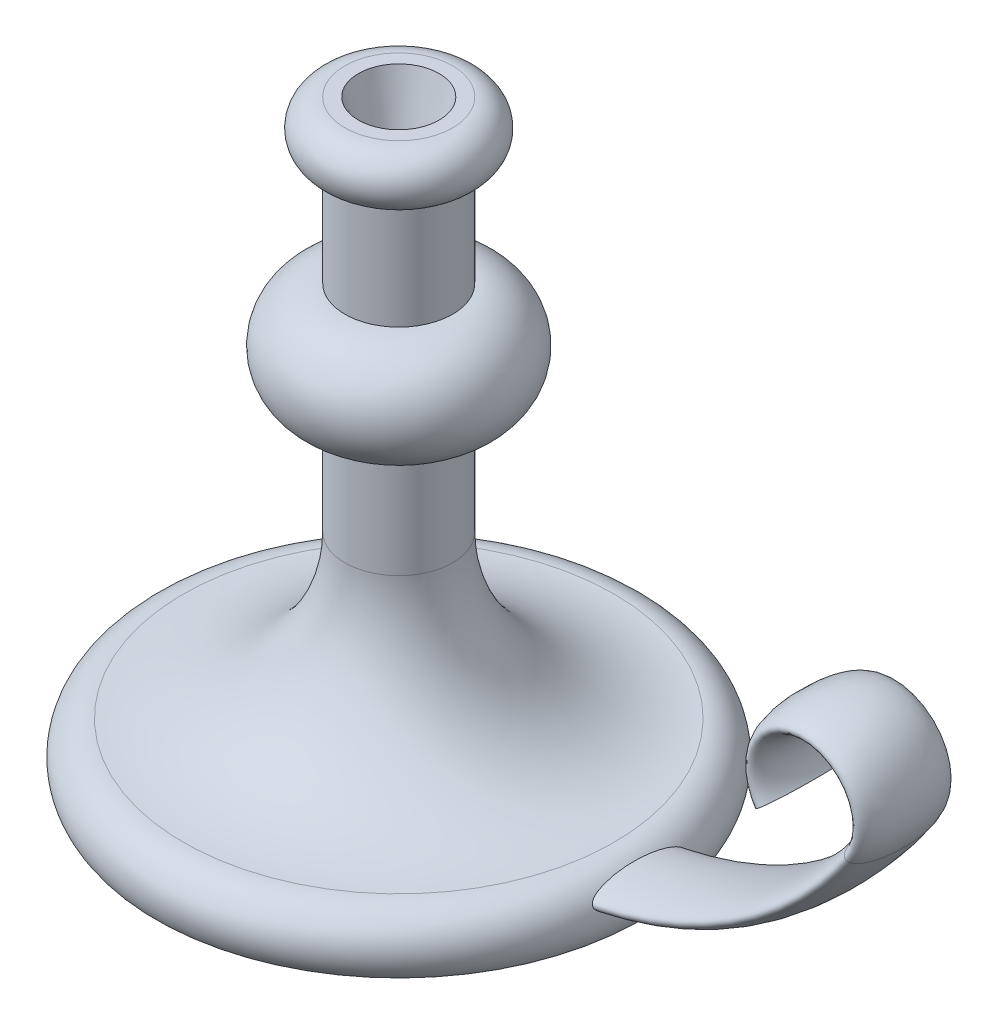
ISO-10303-21;
HEADER;
FILE_DESCRIPTION(('STEP AP214'),'2;1');
FILE_NAME('part.step','',(''),(''),'','','');
FILE_SCHEMA(('AUTOMOTIVE_DESIGN { 1 0 10303 214 1 1 1 1 }'));
ENDSEC;
DATA;
#1=APPLICATION_CONTEXT('core data for automotive mechanical design processes');
#2=APPLICATION_PROTOCOL_DEFINITION('international standard','automotive_design',2000,#1);
#3=PRODUCT_CONTEXT('',#1,'mechanical');
#4=PRODUCT('Part','Part','',(#3));
#5=PRODUCT_RELATED_PRODUCT_CATEGORY('part','',(#4));
#6=PRODUCT_DEFINITION_FORMATION('','',#4);
#7=PRODUCT_DEFINITION_CONTEXT('part definition',#1,'design');
#8=PRODUCT_DEFINITION('design','',#6,#7);
#9=PRODUCT_DEFINITION_SHAPE('','',#8);
#10=(LENGTH_UNIT() NAMED_UNIT(*) SI_UNIT(.MILLI.,.METRE.));
#11=(NAMED_UNIT(*) PLANE_ANGLE_UNIT() SI_UNIT($,.RADIAN.));
#12=(NAMED_UNIT(*) SI_UNIT($,.STERADIAN.) SOLID_ANGLE_UNIT());
#13=UNCERTAINTY_MEASURE_WITH_UNIT(LENGTH_MEASURE(1.E-05),#10,'distance_accuracy_value','');
#14=(GEOMETRIC_REPRESENTATION_CONTEXT(3) GLOBAL_UNCERTAINTY_ASSIGNED_CONTEXT((#13)) GLOBAL_UNIT_ASSIGNED_CONTEXT((#10,
#11,#12)) REPRESENTATION_CONTEXT('',''));
#15=CARTESIAN_POINT('',(0.,0.,0.));
#16=DIRECTION('',(0.,0.,1.));
#17=DIRECTION('',(1.,0.,0.));
#18=AXIS2_PLACEMENT_3D('',#15,#16,#17);
#19=CARTESIAN_POINT('',(0.,0.,0.));
#20=DIRECTION('',(0.,-1.,0.));
#21=DIRECTION('',(0.,0.,-1.));
#22=AXIS2_PLACEMENT_3D('',#19,#20,#21);
#23=PLANE('',#22);
#24=CARTESIAN_POINT('',(0.,0.,0.));
#25=DIRECTION('',(0.,-1.,0.));
#26=DIRECTION('',(0.,0.,-1.));
#27=AXIS2_PLACEMENT_3D('',#24,#25,#26);
#28=CIRCLE('',#27,90.);
#29=CARTESIAN_POINT('',(0.,0.,-90.));
#30=VERTEX_POINT('',#29);
#31=EDGE_CURVE('E63',#30,#30,#28,.T.);
#32=ORIENTED_EDGE('',*,*,#31,.T.);
#33=EDGE_LOOP('',(#32));
#34=FACE_BOUND('',#33,.T.);
#35=ADVANCED_FACE('F31',(#34),#23,.T.);
#36=CARTESIAN_POINT('',(0.,220.,0.));
#37=DIRECTION('',(0.,1.,0.));
#38=DIRECTION('',(0.,0.,1.));
#39=AXIS2_PLACEMENT_3D('',#36,#37,#38);
#40=PLANE('',#39);
#41=CARTESIAN_POINT('',(0.,220.,0.));
#42=DIRECTION('',(0.,1.,0.));
#43=DIRECTION('',(0.,0.,1.));
#44=AXIS2_PLACEMENT_3D('',#41,#42,#43);
#45=CIRCLE('',#44,15.);
#46=CARTESIAN_POINT('',(0.,220.,15.));
#47=VERTEX_POINT('',#46);
#48=EDGE_CURVE('E118',#47,#47,#45,.T.);
#49=ORIENTED_EDGE('',*,*,#48,.F.);
#50=EDGE_LOOP('',(#49));
#51=FACE_BOUND('',#50,.T.);
#52=CARTESIAN_POINT('',(0.,220.,0.));
#53=DIRECTION('',(0.,-1.,0.));
#54=DIRECTION('',(0.,0.,-1.));
#55=AXIS2_PLACEMENT_3D('',#52,#53,#54);
#56=CIRCLE('',#55,20.);
#57=CARTESIAN_POINT('',(0.,220.,-20.));
#58=VERTEX_POINT('',#57);
#59=EDGE_CURVE('E41',#58,#58,#56,.T.);
#60=ORIENTED_EDGE('',*,*,#59,.F.);
#61=EDGE_LOOP('',(#60));
#62=FACE_BOUND('',#61,.T.);
#63=ADVANCED_FACE('F106',(#51,#62),#40,.T.);
#64=CARTESIAN_POINT('',(0.,210.,0.));
#65=DIRECTION('',(0.,-1.,0.));
#66=DIRECTION('',(0.,0.,-1.));
#67=AXIS2_PLACEMENT_3D('',#64,#65,#66);
#68=TOROIDAL_SURFACE('',#67,20.,9.99999999999999);
#69=ORIENTED_EDGE('',*,*,#59,.T.);
#70=EDGE_LOOP('',(#69));
#71=FACE_BOUND('',#70,.T.);
#72=CARTESIAN_POINT('',(0.,200.,0.));
#73=DIRECTION('',(0.,-1.,0.));
#74=DIRECTION('',(0.,0.,-1.));
#75=AXIS2_PLACEMENT_3D('',#72,#73,#74);
#76=CIRCLE('',#75,20.);
#77=CARTESIAN_POINT('',(0.,200.,-20.));
#78=VERTEX_POINT('',#77);
#79=EDGE_CURVE('E45',#78,#78,#76,.T.);
#80=ORIENTED_EDGE('',*,*,#79,.F.);
#81=EDGE_LOOP('',(#80));
#82=FACE_BOUND('',#81,.T.);
#83=ADVANCED_FACE('F103',(#71,#82),#68,.T.);
#84=CARTESIAN_POINT('',(0.,0.,0.));
#85=DIRECTION('',(0.,-1.,0.));
#86=DIRECTION('',(0.,0.,-1.));
#87=AXIS2_PLACEMENT_3D('',#84,#85,#86);
#88=CYLINDRICAL_SURFACE('',#87,20.);
#89=ORIENTED_EDGE('',*,*,#79,.T.);
#90=EDGE_LOOP('',(#89));
#91=FACE_BOUND('',#90,.T.);
#92=CARTESIAN_POINT('',(0.,160.,0.));
#93=DIRECTION('',(0.,-1.,0.));
#94=DIRECTION('',(0.,0.,-1.));
#95=AXIS2_PLACEMENT_3D('',#92,#93,#94);
#96=CIRCLE('',#95,20.);
#97=CARTESIAN_POINT('',(0.,160.,-20.));
#98=VERTEX_POINT('',#97);
#99=EDGE_CURVE('E49',#98,#98,#96,.T.);
#100=ORIENTED_EDGE('',*,*,#99,.F.);
#101=EDGE_LOOP('',(#100));
#102=FACE_BOUND('',#101,.T.);
#103=ADVANCED_FACE('F99',(#91,#102),#88,.T.);
#104=CARTESIAN_POINT('',(0.,140.,0.));
#105=DIRECTION('',(0.,-1.,0.));
#106=DIRECTION('',(0.,0.,-1.));
#107=AXIS2_PLACEMENT_3D('',#104,#105,#106);
#108=TOROIDAL_SURFACE('',#107,20.,20.);
#109=ORIENTED_EDGE('',*,*,#99,.T.);
#110=EDGE_LOOP('',(#109));
#111=FACE_BOUND('',#110,.T.);
#112=CARTESIAN_POINT('',(0.,120.,0.));
#113=DIRECTION('',(0.,-1.,0.));
#114=DIRECTION('',(0.,0.,-1.));
#115=AXIS2_PLACEMENT_3D('',#112,#113,#114);
#116=CIRCLE('',#115,20.);
#117=CARTESIAN_POINT('',(0.,120.,-20.));
#118=VERTEX_POINT('',#117);
#119=EDGE_CURVE('E54',#118,#118,#116,.T.);
#120=ORIENTED_EDGE('',*,*,#119,.F.);
#121=EDGE_LOOP('',(#120));
#122=FACE_BOUND('',#121,.T.);
#123=ADVANCED_FACE('F95',(#111,#122),#108,.T.);
#124=CARTESIAN_POINT('',(0.,0.,0.));
#125=DIRECTION('',(0.,-1.,0.));
#126=DIRECTION('',(0.,0.,-1.));
#127=AXIS2_PLACEMENT_3D('',#124,#125,#126);
#128=CYLINDRICAL_SURFACE('',#127,20.);
#129=ORIENTED_EDGE('',*,*,#119,.T.);
#130=EDGE_LOOP('',(#129));
#131=FACE_BOUND('',#130,.T.);
#132=CARTESIAN_POINT('',(0.,80.,0.));
#133=DIRECTION('',(0.,-1.,0.));
#134=DIRECTION('',(0.,0.,-1.));
#135=AXIS2_PLACEMENT_3D('',#132,#133,#134);
#136=CIRCLE('',#135,20.);
#137=CARTESIAN_POINT('',(0.,80.,-20.));
#138=VERTEX_POINT('',#137);
#139=EDGE_CURVE('E57',#138,#138,#136,.T.);
#140=ORIENTED_EDGE('',*,*,#139,.F.);
#141=EDGE_LOOP('',(#140));
#142=FACE_BOUND('',#141,.T.);
#143=ADVANCED_FACE('F91',(#131,#142),#128,.T.);
#144=CARTESIAN_POINT('',(0.,80.,0.));
#145=DIRECTION('',(0.,-1.,0.));
#146=DIRECTION('',(0.,0.,-1.));
#147=AXIS2_PLACEMENT_3D('',#144,#145,#146);
#148=TOROIDAL_SURFACE('',#147,80.,60.);
#149=ORIENTED_EDGE('',*,*,#139,.T.);
#150=EDGE_LOOP('',(#149));
#151=FACE_BOUND('',#150,.T.);
#152=CARTESIAN_POINT('',(0.,20.,0.));
#153=DIRECTION('',(0.,-1.,0.));
#154=DIRECTION('',(0.,0.,-1.));
#155=AXIS2_PLACEMENT_3D('',#152,#153,#154);
#156=CIRCLE('',#155,80.);
#157=CARTESIAN_POINT('',(0.,20.,-80.));
#158=VERTEX_POINT('',#157);
#159=EDGE_CURVE('E60',#158,#158,#156,.T.);
#160=ORIENTED_EDGE('',*,*,#159,.F.);
#161=EDGE_LOOP('',(#160));
#162=FACE_BOUND('',#161,.T.);
#163=ADVANCED_FACE('F87',(#151,#162),#148,.F.);
#164=CARTESIAN_POINT('',(0.,7.50000000000003,0.));
#165=DIRECTION('',(0.,-1.,0.));
#166=DIRECTION('',(0.,0.,-1.));
#167=AXIS2_PLACEMENT_3D('',#164,#165,#166);
#168=TOROIDAL_SURFACE('',#167,80.,12.5);
#169=CARTESIAN_POINT('',(89.5597422043342,12.9414346567555,-17.5));
#170=CARTESIAN_POINT('',(89.5390682417035,12.9833970763635,-17.499999801476));
#171=CARTESIAN_POINT('',(89.5184948481193,13.0254081758614,-17.4978460786373));
#172=CARTESIAN_POINT('',(89.477707455766,13.1091783719494,-17.4892930018231));
#173=CARTESIAN_POINT('',(89.4574935851385,13.1509373753177,-17.4828921640349));
#174=CARTESIAN_POINT('',(89.3975656488552,13.275424618129,-17.4575317742508));
#175=CARTESIAN_POINT('',(89.358593034799,13.3573066164348,-17.4324146791396));
#176=CARTESIAN_POINT('',(89.2734409816766,13.5379175715786,-17.3597432795598));
#177=CARTESIAN_POINT('',(89.2281121247517,13.6353143232492,-17.3079911474062));
#178=CARTESIAN_POINT('',(89.1421571121495,13.8217561384483,-17.188166079603));
#179=CARTESIAN_POINT('',(89.1015411563845,13.9107830112797,-17.1200586894138));
#180=CARTESIAN_POINT('',(89.0298762971165,14.0690143319055,-16.9825248110394));
#181=CARTESIAN_POINT('',(88.9982786842444,14.1392645151032,-16.9145529225411));
#182=CARTESIAN_POINT('',(88.937830666444,14.274320374163,-16.7722185271802));
#183=CARTESIAN_POINT('',(88.9089824882069,14.3391216321741,-16.6978509317862));
#184=CARTESIAN_POINT('',(88.8535955575885,14.4639952815646,-16.5441752211162));
#185=CARTESIAN_POINT('',(88.8270622241569,14.5240565470722,-16.4648562214599));
#186=CARTESIAN_POINT('',(88.7760324990849,14.639869406975,-16.3025689169611));
#187=CARTESIAN_POINT('',(88.7515354717388,14.6956223459826,-16.2196017634807));
#188=CARTESIAN_POINT('',(88.7047417294347,14.8022966462375,-16.0524591820991));
#189=CARTESIAN_POINT('',(88.6824111309148,14.8532916472492,-15.9683399173081));
#190=CARTESIAN_POINT('',(88.639188061834,14.9520793339758,-15.7978736183899));
#191=CARTESIAN_POINT('',(88.6182958325685,14.9998714823563,-15.7115262138021));
#192=CARTESIAN_POINT('',(88.5574287556144,15.1391199588384,-15.44952020703));
#193=CARTESIAN_POINT('',(88.5193306885353,15.2262946979451,-15.2711446093401));
#194=CARTESIAN_POINT('',(88.446993084953,15.3914560839503,-14.9093240436534));
#195=CARTESIAN_POINT('',(88.4127567918464,15.469435010004,-14.7258749732314));
#196=CARTESIAN_POINT('',(88.3472362016713,15.6180770700464,-14.3544014869796));
#197=CARTESIAN_POINT('',(88.3159681826398,15.6887000486785,-14.1663582382779));
#198=CARTESIAN_POINT('',(88.2560646079385,15.8232632193263,-13.7877426015725));
#199=CARTESIAN_POINT('',(88.2274261580789,15.8872107694165,-13.5971732648847));
#200=CARTESIAN_POINT('',(88.1723521282148,16.0093779596915,-13.2139752998443));
#201=CARTESIAN_POINT('',(88.1459158137057,16.0675995109176,-13.0213473824979));
#202=CARTESIAN_POINT('',(88.0881587196921,16.1938504755766,-12.5829461756591));
#203=CARTESIAN_POINT('',(88.0574088267971,16.260370117645,-12.3366637905583));
#204=CARTESIAN_POINT('',(87.9985123187222,16.3864590847677,-11.842004819733));
#205=CARTESIAN_POINT('',(87.970365975028,16.4460276851698,-11.5936280185527));
#206=CARTESIAN_POINT('',(87.916348258683,16.559094633045,-11.094931062254));
#207=CARTESIAN_POINT('',(87.8904797303634,16.6125854146131,-10.8446088905713));
#208=CARTESIAN_POINT('',(87.8408483965671,16.7140512465656,-10.3426370646258));
#209=CARTESIAN_POINT('',(87.8170856939001,16.7620260276843,-10.0909873461849));
#210=CARTESIAN_POINT('',(87.7486691228052,16.8985839230831,-9.33377768592058));
#211=CARTESIAN_POINT('',(87.7069540377653,16.9796608720202,-8.82658708533015));
#212=CARTESIAN_POINT('',(87.6306961124076,17.1248455016837,-7.80916406760126));
#213=CARTESIAN_POINT('',(87.5961551600075,17.1889487168834,-7.29893088603609));
#214=CARTESIAN_POINT('',(87.5339911377834,17.3022548727762,-6.27558535996648));
#215=CARTESIAN_POINT('',(87.5063790759953,17.3514341291622,-5.7624697416542));
#216=CARTESIAN_POINT('',(87.4581556376937,17.4361006629321,-4.7353382584021));
#217=CARTESIAN_POINT('',(87.4375369377591,17.4716022688271,-4.2213239053269));
#218=CARTESIAN_POINT('',(87.4033485965417,17.5298933049628,-3.19263203564168));
#219=CARTESIAN_POINT('',(87.3897750436296,17.5526897899014,-2.67795504642715));
#220=CARTESIAN_POINT('',(87.3697503063744,17.5861573346741,-1.64816415678591));
#221=CARTESIAN_POINT('',(87.3632979000102,17.5968304749383,-1.13305034650779));
#222=CARTESIAN_POINT('',(87.3567446403377,17.60768667733,0.045192510731027));
#223=CARTESIAN_POINT('',(87.3589979794371,17.6039802512046,0.708375187513528));
#224=CARTESIAN_POINT('',(87.375360353613,17.5767998431173,2.03444017536878));
#225=CARTESIAN_POINT('',(87.3894738801436,17.5533183723369,2.6973222774464));
#226=CARTESIAN_POINT('',(87.429401278711,17.4856044911543,4.02207693580513));
#227=CARTESIAN_POINT('',(87.4552221149227,17.4413597290139,4.6839486555802));
#228=CARTESIAN_POINT('',(87.5182601373715,17.3304493690437,6.00273083681876));
#229=CARTESIAN_POINT('',(87.5554327085336,17.2638714468586,6.65965058375405));
#230=CARTESIAN_POINT('',(87.6198336832519,17.1447808230944,7.64196457807142));
#231=CARTESIAN_POINT('',(87.6427357061842,17.1018902548716,7.96882803392479));
#232=CARTESIAN_POINT('',(87.6915021526186,17.0091104096814,8.62133363379404));
#233=CARTESIAN_POINT('',(87.7173664470654,16.9592214375874,8.94697583037785));
#234=CARTESIAN_POINT('',(87.7721755297609,16.8517641144645,9.59646350792422));
#235=CARTESIAN_POINT('',(87.8011178051597,16.7942020181559,9.92031023084916));
#236=CARTESIAN_POINT('',(87.8623401784718,16.670424389,10.5660151582721));
#237=CARTESIAN_POINT('',(87.8946200133661,16.6042095379317,10.8878735173494));
#238=CARTESIAN_POINT('',(87.9634236652185,16.4608004427521,11.5338084513011));
#239=CARTESIAN_POINT('',(88.0000038204032,16.3834565668023,11.8578460140796));
#240=CARTESIAN_POINT('',(88.0776704479078,16.2167402960611,12.5024294932679));
#241=CARTESIAN_POINT('',(88.1187582871156,16.1273642508179,12.8229743179847));
#242=CARTESIAN_POINT('',(88.1845991136115,15.9822640377112,13.3001792679787));
#243=CARTESIAN_POINT('',(88.2072711562738,15.9320048353495,13.458794776366));
#244=CARTESIAN_POINT('',(88.2542087743505,15.8273740345265,13.7744208617839));
#245=CARTESIAN_POINT('',(88.2784742329896,15.7730027373804,13.9314315554526));
#246=CARTESIAN_POINT('',(88.3288329339647,15.6596363065341,14.2433947335169));
#247=CARTESIAN_POINT('',(88.3549252454499,15.6006435258595,14.39834821894));
#248=CARTESIAN_POINT('',(88.4092696388298,15.4773352517477,14.7057236901227));
#249=CARTESIAN_POINT('',(88.4375213946571,15.4130205617769,14.8581460538574));
#250=CARTESIAN_POINT('',(88.4968507719838,15.2776562950139,15.1609091928641));
#251=CARTESIAN_POINT('',(88.5279487218456,15.2065580859208,15.3112244481845));
#252=CARTESIAN_POINT('',(88.5933850994804,15.0568677679762,15.6074204461967));
#253=CARTESIAN_POINT('',(88.6277241675822,14.978274178274,15.7533003050547));
#254=CARTESIAN_POINT('',(88.7002441190653,14.8125407512939,16.0379741363754));
#255=CARTESIAN_POINT('',(88.7383996400969,14.7254574196197,16.1768067090656));
#256=CARTESIAN_POINT('',(88.7994889081869,14.5866042208345,16.3782369433215));
#257=CARTESIAN_POINT('',(88.8204977413197,14.5389415031663,16.4442523217256));
#258=CARTESIAN_POINT('',(88.8639845053437,14.4405581400327,16.57344963874));
#259=CARTESIAN_POINT('',(88.8864621846816,14.3898380182901,16.636632059411));
#260=CARTESIAN_POINT('',(88.9422432981285,14.2644224068533,16.7835876842853));
#261=CARTESIAN_POINT('',(88.9763364041361,14.1881224618925,16.8657235531464));
#262=CARTESIAN_POINT('',(89.0483213192218,14.0281384901655,17.0203903295081));
#263=CARTESIAN_POINT('',(89.0862061390434,13.9444680822869,17.0929383574397));
#264=CARTESIAN_POINT('',(89.167031158356,13.7675914637829,17.2256585134364));
#265=CARTESIAN_POINT('',(89.2100345714228,13.6742683967974,17.2856436508903));
#266=CARTESIAN_POINT('',(89.2779863638654,13.5285260537469,17.3610498966371));
#267=CARTESIAN_POINT('',(89.3011904906555,13.4790295981996,17.3837437830228));
#268=CARTESIAN_POINT('',(89.348681122482,13.3783655416218,17.4235815208145));
#269=CARTESIAN_POINT('',(89.3729671592224,13.3271986661329,17.4407277474299));
#270=CARTESIAN_POINT('',(89.4344831171652,13.1984825422767,17.4755813984572));
#271=CARTESIAN_POINT('',(89.4722908092758,13.1201458143824,17.4895469950748));
#272=CARTESIAN_POINT('',(89.5490629639974,12.9628453353438,17.5023227338009));
#273=CARTESIAN_POINT('',(89.5880269032797,12.8838818793689,17.5011396310453));
#274=CARTESIAN_POINT('',(89.6659197904111,12.7278461407132,17.4839019863865));
#275=CARTESIAN_POINT('',(89.7048486189822,12.6507699944114,17.4678809909871));
#276=CARTESIAN_POINT('',(89.7818193498578,12.5001197626227,17.4227133423486));
#277=CARTESIAN_POINT('',(89.8198603575275,12.4265491378842,17.393554003752));
#278=CARTESIAN_POINT('',(89.9134049221881,12.2476534190935,17.3068893145741));
#279=CARTESIAN_POINT('',(89.9679590616014,12.145189839,17.2425093702033));
#280=CARTESIAN_POINT('',(90.0730473029299,11.9508453333027,17.0967607254912));
#281=CARTESIAN_POINT('',(90.1235693401402,11.8589958245569,17.0153434992559));
#282=CARTESIAN_POINT('',(90.2171397045064,11.6912868202041,16.8474453840373));
#283=CARTESIAN_POINT('',(90.2604644261217,11.6147475285805,16.7617815283372));
#284=CARTESIAN_POINT('',(90.344182781737,11.4686468553497,16.5833011975358));
#285=CARTESIAN_POINT('',(90.3845736709566,11.3990919854158,16.4904781877927));
#286=CARTESIAN_POINT('',(90.4628381757603,11.2658377500077,16.2994188011804));
#287=CARTESIAN_POINT('',(90.500706012981,11.2021517058673,16.2011708808851));
#288=CARTESIAN_POINT('',(90.5741373771332,11.0799532151566,16.0007631564048));
#289=CARTESIAN_POINT('',(90.6097017753878,11.0214388092179,15.8986048549431));
#290=CARTESIAN_POINT('',(90.6798506810756,10.9071528014044,15.6881130904042));
#291=CARTESIAN_POINT('',(90.7143737156138,10.8515162836077,15.5796863139987));
#292=CARTESIAN_POINT('',(90.781526854715,10.7443116806204,15.3602532814348));
#293=CARTESIAN_POINT('',(90.8141566222384,10.6927443192367,15.2492465708926));
#294=CARTESIAN_POINT('',(90.8777648134716,10.5931040659528,15.0249916383677));
#295=CARTESIAN_POINT('',(90.9087405253397,10.5450368683677,14.9117401290226));
#296=CARTESIAN_POINT('',(90.9691471982793,10.4520756013828,14.6835311743098));
#297=CARTESIAN_POINT('',(90.9985780215572,10.4071818149066,14.5685735779397));
#298=CARTESIAN_POINT('',(91.0847991405954,10.2766779068817,14.2214202083285));
#299=CARTESIAN_POINT('',(91.1394751820611,10.1953120661678,13.9870973298016));
#300=CARTESIAN_POINT('',(91.2442711007082,10.0414382528769,13.5131955707523));
#301=CARTESIAN_POINT('',(91.2943656433969,9.96897885186311,13.2735956051686));
#302=CARTESIAN_POINT('',(91.3902100238879,9.83200733703221,12.7915919671301));
#303=CARTESIAN_POINT('',(91.4359646930144,9.76748636147267,12.5491917575654));
#304=CARTESIAN_POINT('',(91.5236096481364,9.64522219888431,12.0620925005217));
#305=CARTESIAN_POINT('',(91.5655011282609,9.58747691594508,11.8173941893391));
#306=CARTESIAN_POINT('',(91.6521116126999,9.46924027933524,11.2872469347067));
#307=CARTESIAN_POINT('',(91.6962295705011,9.40975960214714,11.0014751279474));
#308=CARTESIAN_POINT('',(91.7801283472624,9.29775188889533,10.4279264531642));
#309=CARTESIAN_POINT('',(91.8199088096836,9.24522542438709,10.1401494223777));
#310=CARTESIAN_POINT('',(91.8954614399622,9.14632559185103,9.56268010524031));
#311=CARTESIAN_POINT('',(91.9312290206063,9.0999592546745,9.27298601993965));
#312=CARTESIAN_POINT('',(91.9989276864042,9.01286744655937,8.69230014878699));
#313=CARTESIAN_POINT('',(92.0308586021365,8.9721422247118,8.40130830621603));
#314=CARTESIAN_POINT('',(92.1212362536797,8.85762649139711,7.52609730454305));
#315=CARTESIAN_POINT('',(92.1741858932312,8.79160214830541,6.94027690543028));
#316=CARTESIAN_POINT('',(92.2664432393134,8.67757998740736,5.76570323769251));
#317=CARTESIAN_POINT('',(92.3057471215828,8.62958722269175,5.17694919372208));
#318=CARTESIAN_POINT('',(92.3712614806833,8.55005786852791,3.99846267764638));
#319=CARTESIAN_POINT('',(92.397490620857,8.51849781956405,3.4087328127695));
#320=CARTESIAN_POINT('',(92.4372887662618,8.47075403181992,2.22876713112331));
#321=CARTESIAN_POINT('',(92.4508691565616,8.45455646511476,1.63853224890771));
#322=CARTESIAN_POINT('',(92.4655827970144,8.43701196328774,0.458012213446806));
#323=CARTESIAN_POINT('',(92.4667228078028,8.43565696207802,-0.132272738146172));
#324=CARTESIAN_POINT('',(92.4565896588575,8.44773292337775,-1.31245514854731));
#325=CARTESIAN_POINT('',(92.4453194307794,8.46116039384158,-1.90235266594664));
#326=CARTESIAN_POINT('',(92.4152323530397,8.49720127894515,-2.91293122103704));
#327=CARTESIAN_POINT('',(92.399488633902,8.51609771327288,-3.3338416972821));
#328=CARTESIAN_POINT('',(92.3614792935747,8.56194763892484,-4.17492724051895));
#329=CARTESIAN_POINT('',(92.3392138048888,8.58890096655604,-4.59510232227741));
#330=CARTESIAN_POINT('',(92.2880200589734,8.6512809200387,-5.43403090747395));
#331=CARTESIAN_POINT('',(92.2590979156981,8.68669977168036,-5.85278535976603));
#332=CARTESIAN_POINT('',(92.1943469782254,8.7666502712717,-6.68888197530223));
#333=CARTESIAN_POINT('',(92.1585184884691,8.81118151754005,-7.10622419997439));
#334=CARTESIAN_POINT('',(92.0913883463787,8.89546537402932,-7.8148657409625));
#335=CARTESIAN_POINT('',(92.0619223972662,8.93268360128543,-8.10664239637726));
#336=CARTESIAN_POINT('',(91.9992751831063,9.01244031978375,-8.68906573698712));
#337=CARTESIAN_POINT('',(91.9660940114555,9.05497867728699,-8.97971245039772));
#338=CARTESIAN_POINT('',(91.8958362735746,9.14586079320746,-9.55954014430427));
#339=CARTESIAN_POINT('',(91.8587608402588,9.19420286379699,-9.84872152557154));
#340=CARTESIAN_POINT('',(91.7804640728037,9.29733424331395,-10.4253680209641));
#341=CARTESIAN_POINT('',(91.7392428979817,9.35212330450288,-10.712833200592));
#342=CARTESIAN_POINT('',(91.6651852642288,9.45169652539591,-11.2009114295784));
#343=CARTESIAN_POINT('',(91.6334740038737,9.49464812309781,-11.40206987551));
#344=CARTESIAN_POINT('',(91.5676939042956,9.58452467571579,-11.8031075357917));
#345=CARTESIAN_POINT('',(91.5336251409561,9.63144950275204,-12.0029867910906));
#346=CARTESIAN_POINT('',(91.4629103530476,9.72978070272849,-12.4014607237167));
#347=CARTESIAN_POINT('',(91.4262611401135,9.78119263934331,-12.6000534686611));
#348=CARTESIAN_POINT('',(91.3502044219463,9.88900570640469,-12.9953470629621));
#349=CARTESIAN_POINT('',(91.3107970144953,9.94540666000191,-13.1920479791058));
#350=CARTESIAN_POINT('',(91.2276212473531,10.0658223958309,-13.5894074367472));
#351=CARTESIAN_POINT('',(91.1837532035468,10.1300241281593,-13.7899888884083));
#352=CARTESIAN_POINT('',(91.0923799134056,10.2655141547625,-14.1878967143446));
#353=CARTESIAN_POINT('',(91.0448751095645,10.336801587216,-14.3852234810857));
#354=CARTESIAN_POINT('',(90.9457925667077,10.4876709266022,-14.7751386376011));
#355=CARTESIAN_POINT('',(90.8942241714189,10.5672339324145,-14.9677366350334));
#356=CARTESIAN_POINT('',(90.7862143447504,10.7366119201245,-15.346898208625));
#357=CARTESIAN_POINT('',(90.729775697936,10.8264210531393,-15.5334651502502));
#358=CARTESIAN_POINT('',(90.6212033814548,11.0023988323086,-15.8665064968248));
#359=CARTESIAN_POINT('',(90.5700064097146,11.086523252512,-16.0143454854332));
#360=CARTESIAN_POINT('',(90.489494836857,11.2210719601951,-16.2297682662972));
#361=CARTESIAN_POINT('',(90.4620005609574,11.2673801193659,-16.3006068507202));
#362=CARTESIAN_POINT('',(90.405663881725,11.3631027215139,-16.4395882553711));
#363=CARTESIAN_POINT('',(90.376821791941,11.4125164429423,-16.50773169584));
#364=CARTESIAN_POINT('',(90.3173000187957,11.5154431106471,-16.6414688232468));
#365=CARTESIAN_POINT('',(90.2866026931881,11.5689974830643,-16.7070230259515));
#366=CARTESIAN_POINT('',(90.2235248416842,11.6801460587692,-16.8338288983818));
#367=CARTESIAN_POINT('',(90.1911437589228,11.7377416008125,-16.8950791287129));
#368=CARTESIAN_POINT('',(90.1246746009051,11.8572287345103,-17.0118342639399));
#369=CARTESIAN_POINT('',(90.0905922975461,11.9191060427893,-17.0673568649591));
#370=CARTESIAN_POINT('',(90.0205945500714,12.0476162041313,-17.1711750807903));
#371=CARTESIAN_POINT('',(89.9846810936559,12.1142439306956,-17.2194783172374));
#372=CARTESIAN_POINT('',(89.9072691914908,12.2595601926768,-17.3112578352747));
#373=CARTESIAN_POINT('',(89.865573443312,12.3387868393086,-17.3537501287488));
#374=CARTESIAN_POINT('',(89.8018195982617,12.4615624088594,-17.4064482222614));
#375=CARTESIAN_POINT('',(89.78038597328,12.5031053112503,-17.4221652201551));
#376=CARTESIAN_POINT('',(89.7372110357347,12.5873443591989,-17.4495428289002));
#377=CARTESIAN_POINT('',(89.715469865874,12.6300399777375,-17.4612052607452));
#378=CARTESIAN_POINT('',(89.6713740740665,12.7172109602879,-17.4803130763978));
#379=CARTESIAN_POINT('',(89.6490160377543,12.7617048684931,-17.4876666954989));
#380=CARTESIAN_POINT('',(89.6043139799334,12.8512585298285,-17.4975110322341));
#381=CARTESIAN_POINT('',(89.5819699650801,12.8963184572137,-17.5000002134446));
#382=CARTESIAN_POINT('',(89.5597422043342,12.9414346567555,-17.5));
#383=B_SPLINE_CURVE_WITH_KNOTS('',3,(#169,#170,#171,#172,#173,#174,#175,#176,#177,#178,#179,
#180,#181,#182,#183,#184,#185,#186,#187,#188,#189,#190,#191,#192,#193,#194,#195,#196,#197,#198,
#199,#200,#201,#202,#203,#204,#205,#206,#207,#208,#209,#210,#211,#212,#213,#214,#215,#216,#217,
#218,#219,#220,#221,#222,#223,#224,#225,#226,#227,#228,#229,#230,#231,#232,#233,#234,#235,#236,
#237,#238,#239,#240,#241,#242,#243,#244,#245,#246,#247,#248,#249,#250,#251,#252,#253,#254,#255,
#256,#257,#258,#259,#260,#261,#262,#263,#264,#265,#266,#267,#268,#269,#270,#271,#272,#273,#274,
#275,#276,#277,#278,#279,#280,#281,#282,#283,#284,#285,#286,#287,#288,#289,#290,#291,#292,#293,
#294,#295,#296,#297,#298,#299,#300,#301,#302,#303,#304,#305,#306,#307,#308,#309,#310,#311,#312,
#313,#314,#315,#316,#317,#318,#319,#320,#321,#322,#323,#324,#325,#326,#327,#328,#329,#330,#331,
#332,#333,#334,#335,#336,#337,#338,#339,#340,#341,#342,#343,#344,#345,#346,#347,#348,#349,#350,
#351,#352,#353,#354,#355,#356,#357,#358,#359,#360,#361,#362,#363,#364,#365,#366,#367,#368,#369,
#370,#371,#372,#373,#374,#375,#376,#377,#378,#379,#380,#381,#382),.UNSPECIFIED.,.T.,.F.,(4,2,2,
2,2,2,2,2,2,2,2,2,2,2,2,2,2,2,2,2,2,2,2,2,2,2,2,2,2,2,2,2,2,2,2,2,2,2,2,2,2,2,2,2,2,2,2,2,2,2,2,
2,2,2,2,2,2,2,2,2,2,2,2,2,2,2,2,2,2,2,2,2,2,2,2,2,2,2,2,2,2,2,2,2,2,2,2,2,2,2,2,2,2,2,2,2,2,2,2,
2,2,2,2,2,2,2,4),(0.,0.14028211001699,0.280613256161182,0.561461564225126,0.917223769341694,
1.27374211332868,1.58149644875512,1.88949794489937,2.19820212539505,2.50680956807613,
2.80932632770101,3.11189371339087,3.71792129086061,4.32445412269163,4.93414127512148,
5.54314913395225,6.15195304286655,6.9226740130309,7.69347525989553,8.46522575436398,
9.23701390615445,10.782534460902,12.3284612151258,13.8768286753822,15.4235696486732,
16.9694509143284,18.5150668584835,20.504246667305,22.4941801183611,24.485298851403,
26.4686905809744,27.459998906525,28.4512640608193,29.4417260743116,30.4321100930468,
31.4373321749632,32.4428599224087,32.946583569266,33.4502703412871,33.9537023077348,
34.4570584075532,34.9643418345013,35.4717256930964,35.9759372580731,36.2281107568737,
36.4802411813,36.8312072460144,37.181537891104,37.5367612141431,37.7140754934857,
37.8913137556299,38.1543004158639,38.4171698086856,38.6794463357425,38.9419766409756,
39.3379141865755,39.7349951838558,40.1027739065829,40.470892391606,40.839826864643,
41.2086209555952,41.5884869463043,41.9684203545957,42.3489586608921,42.7295308511683,
43.4911928834881,44.2568399239569,45.0216243573453,45.7861715944571,46.6716652705937,
47.5572316789028,48.4438002995172,49.3304080552896,51.1055666497457,52.8812223365025,
54.654336079966,56.4258523069849,58.1964057681726,59.9665410633639,61.231311473196,
62.4960561882573,63.7596438732327,65.0231758702887,65.9099510809563,66.7967040040927,
67.6831996648504,68.569661271358,69.193982780215,69.8182842026874,70.4433710180116,
71.068435684298,71.7136688505262,72.3588236339987,73.0025359817189,73.6458826951297,
74.1782561728135,74.4451297056834,74.7119414605322,74.9818957428949,75.2519398816414,
75.5211229919271,75.7900198815155,76.0861439670073,76.233946529996,76.381682625628,
76.5324603376654,76.68328566487),.UNSPECIFIED.);
#384=CARTESIAN_POINT('',(89.5597422043342,12.9414346567555,-17.5));
#385=VERTEX_POINT('',#384);
#386=EDGE_CURVE('E10',#385,#385,#383,.T.);
#387=ORIENTED_EDGE('',*,*,#386,.F.);
#388=EDGE_LOOP('',(#387));
#389=FACE_BOUND('',#388,.T.);
#390=ORIENTED_EDGE('',*,*,#159,.T.);
#391=EDGE_LOOP('',(#390));
#392=FACE_BOUND('',#391,.T.);
#393=ORIENTED_EDGE('',*,*,#31,.F.);
#394=EDGE_LOOP('',(#393));
#395=FACE_BOUND('',#394,.T.);
#396=ADVANCED_FACE('F80',(#389,#392,#395),#168,.T.);
#397=CARTESIAN_POINT('',(183.592070943083,75.,0.));
#398=DIRECTION('',(0.566666666666667,0.823947139620551,0.));
#399=DIRECTION('',(0.,0.,-1.));
#400=AXIS2_PLACEMENT_3D('',#397,#398,#399);
#401=ELLIPSE('',#400,17.5,5.);
#402=CARTESIAN_POINT('',(167.113128150672,86.3333333333333,0.));
#403=DIRECTION('',(0.,0.,1.));
#404=AXIS1_PLACEMENT('',#402,#403);
#405=SURFACE_OF_REVOLUTION('',#401,#404);
#406=CARTESIAN_POINT('',(183.592070943083,75.,-17.5));
#407=VERTEX_POINT('',#406);
#408=EDGE_CURVE('E69',#407,#407,#401,.T.);
#409=ORIENTED_EDGE('',*,*,#408,.T.);
#410=EDGE_LOOP('',(#409));
#411=FACE_BOUND('',#410,.T.);
#412=CARTESIAN_POINT('',(150.634185358261,74.9999999999998,0.));
#413=DIRECTION('',(0.56666666666668,-0.823947139620542,0.));
#414=DIRECTION('',(0.,0.,-1.));
#415=AXIS2_PLACEMENT_3D('',#412,#413,#414);
#416=ELLIPSE('',#415,17.5,5.);
#417=CARTESIAN_POINT('',(150.634185358261,74.9999999999998,-17.5));
#418=VERTEX_POINT('',#417);
#419=EDGE_CURVE('E66',#418,#418,#416,.T.);
#420=ORIENTED_EDGE('',*,*,#419,.F.);
#421=EDGE_LOOP('',(#420));
#422=FACE_BOUND('',#421,.T.);
#423=ADVANCED_FACE('F77',(#411,#422),#405,.F.);
#424=CARTESIAN_POINT('',(60.,10.,0.));
#425=DIRECTION('',(1.,0.,0.));
#426=DIRECTION('',(0.,0.,-1.));
#427=AXIS2_PLACEMENT_3D('',#424,#425,#426);
#428=ELLIPSE('',#427,17.5,5.);
#429=CARTESIAN_POINT('',(60.,160.,0.));
#430=DIRECTION('',(0.,0.,1.));
#431=AXIS1_PLACEMENT('',#429,#430);
#432=SURFACE_OF_REVOLUTION('',#428,#431);
#433=ORIENTED_EDGE('',*,*,#386,.T.);
#434=EDGE_LOOP('',(#433));
#435=FACE_BOUND('',#434,.T.);
#436=ORIENTED_EDGE('',*,*,#408,.F.);
#437=EDGE_LOOP('',(#436));
#438=FACE_BOUND('',#437,.T.);
#439=ADVANCED_FACE('F79',(#435,#438),#432,.F.);
#440=CARTESIAN_POINT('',(150.634185358261,74.9999999999998,0.));
#441=DIRECTION('',(0.56666666666668,-0.823947139620542,0.));
#442=DIRECTION('',(0.,0.,-1.));
#443=AXIS2_PLACEMENT_3D('',#440,#441,#442);
#444=PLANE('',#443);
#445=ORIENTED_EDGE('',*,*,#419,.T.);
#446=EDGE_LOOP('',(#445));
#447=FACE_BOUND('',#446,.T.);
#448=ADVANCED_FACE('F128',(#447),#444,.T.);
#449=CARTESIAN_POINT('',(0.,220.,0.));
#450=DIRECTION('',(0.,1.,0.));
#451=DIRECTION('',(0.,0.,1.));
#452=AXIS2_PLACEMENT_3D('',#449,#450,#451);
#453=CONICAL_SURFACE('',#452,15.,0.26179938779915);
#454=CARTESIAN_POINT('',(0.,195.,0.));
#455=DIRECTION('',(0.,1.,0.));
#456=DIRECTION('',(0.,0.,1.));
#457=AXIS2_PLACEMENT_3D('',#454,#455,#456);
#458=CIRCLE('',#457,8.30127018922192);
#459=CARTESIAN_POINT('',(0.,195.,8.30127018922192));
#460=VERTEX_POINT('',#459);
#461=EDGE_CURVE('E73',#460,#460,#458,.T.);
#462=ORIENTED_EDGE('',*,*,#461,.F.);
#463=EDGE_LOOP('',(#462));
#464=FACE_BOUND('',#463,.T.);
#465=ORIENTED_EDGE('',*,*,#48,.T.);
#466=EDGE_LOOP('',(#465));
#467=FACE_BOUND('',#466,.T.);
#468=ADVANCED_FACE('F126',(#464,#467),#453,.F.);
#469=CARTESIAN_POINT('',(0.,195.,0.));
#470=DIRECTION('',(0.,1.,0.));
#471=DIRECTION('',(0.,0.,1.));
#472=AXIS2_PLACEMENT_3D('',#469,#470,#471);
#473=PLANE('',#472);
#474=ORIENTED_EDGE('',*,*,#461,.T.);
#475=EDGE_LOOP('',(#474));
#476=FACE_BOUND('',#475,.T.);
#477=ADVANCED_FACE('F124',(#476),#473,.T.);
#478=CLOSED_SHELL('',(#35,#63,#83,#103,#123,#143,#163,#396,#423,#439,#448,#468,#477));
#479=MANIFOLD_SOLID_BREP('B2',#478);
#480=ADVANCED_BREP_SHAPE_REPRESENTATION('',(#18,#479),#14);
#481=SHAPE_DEFINITION_REPRESENTATION(#9,#480);
ENDSEC;
END-ISO-10303-21;
